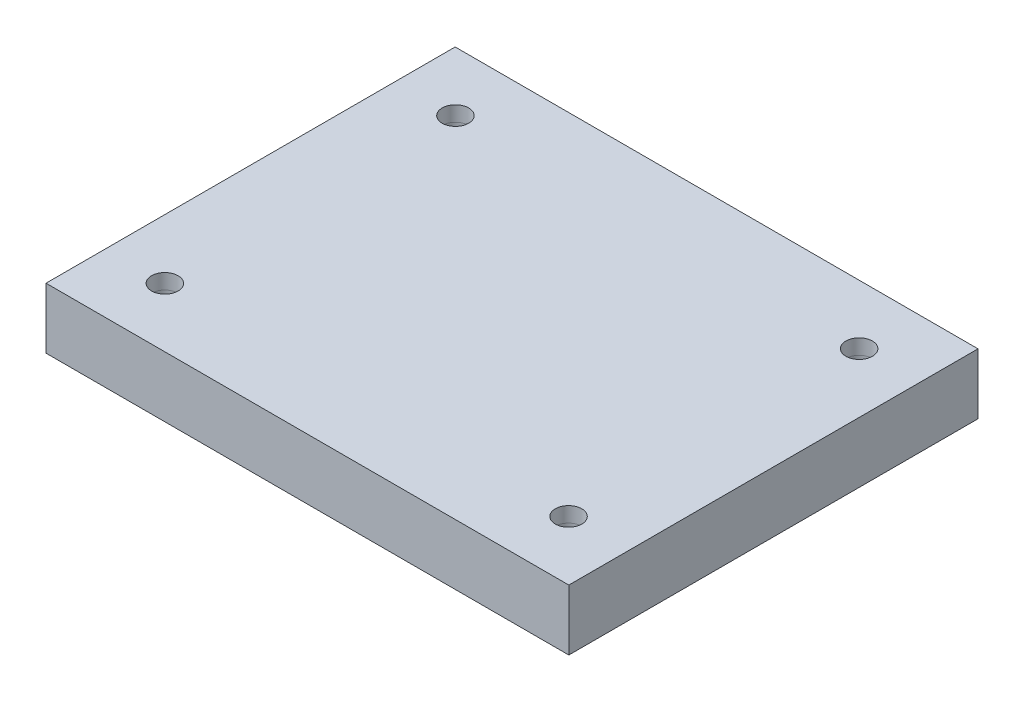
ISO-10303-21;
HEADER;
FILE_DESCRIPTION(('STEP AP214'),'2;1');
FILE_NAME('part.step','',(''),(''),'','','');
FILE_SCHEMA(('AUTOMOTIVE_DESIGN { 1 0 10303 214 1 1 1 1 }'));
ENDSEC;
DATA;
#1=APPLICATION_CONTEXT('core data for automotive mechanical design processes');
#2=APPLICATION_PROTOCOL_DEFINITION('international standard','automotive_design',2000,#1);
#3=PRODUCT_CONTEXT('',#1,'mechanical');
#4=PRODUCT('Part','Part','',(#3));
#5=PRODUCT_RELATED_PRODUCT_CATEGORY('part','',(#4));
#6=PRODUCT_DEFINITION_FORMATION('','',#4);
#7=PRODUCT_DEFINITION_CONTEXT('part definition',#1,'design');
#8=PRODUCT_DEFINITION('design','',#6,#7);
#9=PRODUCT_DEFINITION_SHAPE('','',#8);
#10=(LENGTH_UNIT() NAMED_UNIT(*) SI_UNIT(.MILLI.,.METRE.));
#11=(NAMED_UNIT(*) PLANE_ANGLE_UNIT() SI_UNIT($,.RADIAN.));
#12=(NAMED_UNIT(*) SI_UNIT($,.STERADIAN.) SOLID_ANGLE_UNIT());
#13=UNCERTAINTY_MEASURE_WITH_UNIT(LENGTH_MEASURE(1.E-05),#10,'distance_accuracy_value','');
#14=(GEOMETRIC_REPRESENTATION_CONTEXT(3) GLOBAL_UNCERTAINTY_ASSIGNED_CONTEXT((#13)) GLOBAL_UNIT_ASSIGNED_CONTEXT((#10,
#11,#12)) REPRESENTATION_CONTEXT('',''));
#15=CARTESIAN_POINT('',(0.,0.,0.));
#16=DIRECTION('',(0.,0.,1.));
#17=DIRECTION('',(1.,0.,0.));
#18=AXIS2_PLACEMENT_3D('',#15,#16,#17);
#19=CARTESIAN_POINT('',(26.638347595,0.,19.175016295));
#20=DIRECTION('',(0.,-1.,0.));
#21=DIRECTION('',(0.,0.,-1.));
#22=AXIS2_PLACEMENT_3D('',#19,#20,#21);
#23=PLANE('',#22);
#24=CARTESIAN_POINT('',(26.638347595,0.,19.175016295));
#25=DIRECTION('',(0.,-1.,0.));
#26=DIRECTION('',(0.,0.,-1.));
#27=AXIS2_PLACEMENT_3D('',#24,#25,#26);
#28=CIRCLE('',#27,3.9);
#29=CARTESIAN_POINT('',(26.638347595,0.,15.275016295));
#30=VERTEX_POINT('',#29);
#31=EDGE_CURVE('E68',#30,#30,#28,.T.);
#32=ORIENTED_EDGE('',*,*,#31,.T.);
#33=EDGE_LOOP('',(#32));
#34=FACE_BOUND('',#33,.T.);
#35=CARTESIAN_POINT('',(26.638347595,0.,19.175016295));
#36=DIRECTION('',(0.,-1.,0.));
#37=DIRECTION('',(0.,0.,-1.));
#38=AXIS2_PLACEMENT_3D('',#35,#36,#37);
#39=CIRCLE('',#38,1.75);
#40=CARTESIAN_POINT('',(26.638347595,0.,17.425016295));
#41=VERTEX_POINT('',#40);
#42=EDGE_CURVE('E56',#41,#41,#39,.T.);
#43=ORIENTED_EDGE('',*,*,#42,.F.);
#44=EDGE_LOOP('',(#43));
#45=FACE_BOUND('',#44,.T.);
#46=ADVANCED_FACE('F52',(#34,#45),#23,.T.);
#47=CARTESIAN_POINT('',(26.638347595,6.,19.175016295));
#48=DIRECTION('',(0.,-1.,0.));
#49=DIRECTION('',(0.,0.,-1.));
#50=AXIS2_PLACEMENT_3D('',#47,#48,#49);
#51=PLANE('',#50);
#52=CARTESIAN_POINT('',(26.638347595,6.,19.175016295));
#53=DIRECTION('',(0.,-1.,0.));
#54=DIRECTION('',(0.,0.,-1.));
#55=AXIS2_PLACEMENT_3D('',#52,#53,#54);
#56=CIRCLE('',#55,3.9);
#57=CARTESIAN_POINT('',(26.638347595,6.,15.275016295));
#58=VERTEX_POINT('',#57);
#59=EDGE_CURVE('E66',#58,#58,#56,.T.);
#60=ORIENTED_EDGE('',*,*,#59,.F.);
#61=EDGE_LOOP('',(#60));
#62=FACE_BOUND('',#61,.T.);
#63=CARTESIAN_POINT('',(26.638347595,6.,19.175016295));
#64=DIRECTION('',(0.,-1.,0.));
#65=DIRECTION('',(0.,0.,-1.));
#66=AXIS2_PLACEMENT_3D('',#63,#64,#65);
#67=CIRCLE('',#66,1.75);
#68=CARTESIAN_POINT('',(26.638347595,6.,17.425016295));
#69=VERTEX_POINT('',#68);
#70=EDGE_CURVE('E11',#69,#69,#67,.T.);
#71=ORIENTED_EDGE('',*,*,#70,.T.);
#72=EDGE_LOOP('',(#71));
#73=FACE_BOUND('',#72,.T.);
#74=ADVANCED_FACE('F77',(#62,#73),#51,.F.);
#75=CARTESIAN_POINT('',(26.638347595,0.,19.175016295));
#76=DIRECTION('',(0.,1.,0.));
#77=DIRECTION('',(0.,0.,1.));
#78=AXIS2_PLACEMENT_3D('',#75,#76,#77);
#79=CYLINDRICAL_SURFACE('',#78,3.9);
#80=ORIENTED_EDGE('',*,*,#31,.F.);
#81=EDGE_LOOP('',(#80));
#82=FACE_BOUND('',#81,.T.);
#83=ORIENTED_EDGE('',*,*,#59,.T.);
#84=EDGE_LOOP('',(#83));
#85=FACE_BOUND('',#84,.T.);
#86=ADVANCED_FACE('F75',(#82,#85),#79,.T.);
#87=CARTESIAN_POINT('',(26.638347595,0.,19.175016295));
#88=DIRECTION('',(0.,1.,0.));
#89=DIRECTION('',(0.,0.,1.));
#90=AXIS2_PLACEMENT_3D('',#87,#88,#89);
#91=CYLINDRICAL_SURFACE('',#90,1.75);
#92=ORIENTED_EDGE('',*,*,#42,.T.);
#93=EDGE_LOOP('',(#92));
#94=FACE_BOUND('',#93,.T.);
#95=ORIENTED_EDGE('',*,*,#70,.F.);
#96=EDGE_LOOP('',(#95));
#97=FACE_BOUND('',#96,.T.);
#98=ADVANCED_FACE('F54',(#94,#97),#91,.F.);
#99=CLOSED_SHELL('',(#46,#74,#86,#98));
#100=MANIFOLD_SOLID_BREP('B2',#99);
#101=CARTESIAN_POINT('',(26.638347595,0.,-19.175016295));
#102=DIRECTION('',(0.,-1.,0.));
#103=DIRECTION('',(0.,0.,-1.));
#104=AXIS2_PLACEMENT_3D('',#101,#102,#103);
#105=PLANE('',#104);
#106=CARTESIAN_POINT('',(26.638347595,0.,-19.175016295));
#107=DIRECTION('',(0.,-1.,0.));
#108=DIRECTION('',(0.,0.,-1.));
#109=AXIS2_PLACEMENT_3D('',#106,#107,#108);
#110=CIRCLE('',#109,3.9);
#111=CARTESIAN_POINT('',(26.638347595,0.,-23.075016295));
#112=VERTEX_POINT('',#111);
#113=EDGE_CURVE('E146',#112,#112,#110,.T.);
#114=ORIENTED_EDGE('',*,*,#113,.T.);
#115=EDGE_LOOP('',(#114));
#116=FACE_BOUND('',#115,.T.);
#117=CARTESIAN_POINT('',(26.638347595,0.,-19.175016295));
#118=DIRECTION('',(0.,-1.,0.));
#119=DIRECTION('',(0.,0.,-1.));
#120=AXIS2_PLACEMENT_3D('',#117,#118,#119);
#121=CIRCLE('',#120,1.75);
#122=CARTESIAN_POINT('',(26.638347595,0.,-20.925016295));
#123=VERTEX_POINT('',#122);
#124=EDGE_CURVE('E134',#123,#123,#121,.T.);
#125=ORIENTED_EDGE('',*,*,#124,.F.);
#126=EDGE_LOOP('',(#125));
#127=FACE_BOUND('',#126,.T.);
#128=ADVANCED_FACE('F130',(#116,#127),#105,.T.);
#129=CARTESIAN_POINT('',(26.638347595,6.,-19.175016295));
#130=DIRECTION('',(0.,-1.,0.));
#131=DIRECTION('',(0.,0.,-1.));
#132=AXIS2_PLACEMENT_3D('',#129,#130,#131);
#133=PLANE('',#132);
#134=CARTESIAN_POINT('',(26.638347595,6.,-19.175016295));
#135=DIRECTION('',(0.,-1.,0.));
#136=DIRECTION('',(0.,0.,-1.));
#137=AXIS2_PLACEMENT_3D('',#134,#135,#136);
#138=CIRCLE('',#137,3.9);
#139=CARTESIAN_POINT('',(26.638347595,6.,-23.075016295));
#140=VERTEX_POINT('',#139);
#141=EDGE_CURVE('E144',#140,#140,#138,.T.);
#142=ORIENTED_EDGE('',*,*,#141,.F.);
#143=EDGE_LOOP('',(#142));
#144=FACE_BOUND('',#143,.T.);
#145=CARTESIAN_POINT('',(26.638347595,6.,-19.175016295));
#146=DIRECTION('',(0.,-1.,0.));
#147=DIRECTION('',(0.,0.,-1.));
#148=AXIS2_PLACEMENT_3D('',#145,#146,#147);
#149=CIRCLE('',#148,1.75);
#150=CARTESIAN_POINT('',(26.638347595,6.,-20.925016295));
#151=VERTEX_POINT('',#150);
#152=EDGE_CURVE('E51',#151,#151,#149,.T.);
#153=ORIENTED_EDGE('',*,*,#152,.T.);
#154=EDGE_LOOP('',(#153));
#155=FACE_BOUND('',#154,.T.);
#156=ADVANCED_FACE('F155',(#144,#155),#133,.F.);
#157=CARTESIAN_POINT('',(26.638347595,0.,-19.175016295));
#158=DIRECTION('',(0.,1.,0.));
#159=DIRECTION('',(0.,0.,1.));
#160=AXIS2_PLACEMENT_3D('',#157,#158,#159);
#161=CYLINDRICAL_SURFACE('',#160,3.9);
#162=ORIENTED_EDGE('',*,*,#113,.F.);
#163=EDGE_LOOP('',(#162));
#164=FACE_BOUND('',#163,.T.);
#165=ORIENTED_EDGE('',*,*,#141,.T.);
#166=EDGE_LOOP('',(#165));
#167=FACE_BOUND('',#166,.T.);
#168=ADVANCED_FACE('F153',(#164,#167),#161,.T.);
#169=CARTESIAN_POINT('',(26.638347595,0.,-19.175016295));
#170=DIRECTION('',(0.,1.,0.));
#171=DIRECTION('',(0.,0.,1.));
#172=AXIS2_PLACEMENT_3D('',#169,#170,#171);
#173=CYLINDRICAL_SURFACE('',#172,1.75);
#174=ORIENTED_EDGE('',*,*,#124,.T.);
#175=EDGE_LOOP('',(#174));
#176=FACE_BOUND('',#175,.T.);
#177=ORIENTED_EDGE('',*,*,#152,.F.);
#178=EDGE_LOOP('',(#177));
#179=FACE_BOUND('',#178,.T.);
#180=ADVANCED_FACE('F132',(#176,#179),#173,.F.);
#181=CLOSED_SHELL('',(#128,#156,#168,#180));
#182=MANIFOLD_SOLID_BREP('B6',#181);
#183=CARTESIAN_POINT('',(-26.638347595,0.,-19.175016295));
#184=DIRECTION('',(0.,-1.,0.));
#185=DIRECTION('',(0.,0.,-1.));
#186=AXIS2_PLACEMENT_3D('',#183,#184,#185);
#187=PLANE('',#186);
#188=CARTESIAN_POINT('',(-26.638347595,0.,-19.175016295));
#189=DIRECTION('',(0.,-1.,0.));
#190=DIRECTION('',(0.,0.,-1.));
#191=AXIS2_PLACEMENT_3D('',#188,#189,#190);
#192=CIRCLE('',#191,3.9);
#193=CARTESIAN_POINT('',(-26.638347595,0.,-23.075016295));
#194=VERTEX_POINT('',#193);
#195=EDGE_CURVE('E223',#194,#194,#192,.T.);
#196=ORIENTED_EDGE('',*,*,#195,.T.);
#197=EDGE_LOOP('',(#196));
#198=FACE_BOUND('',#197,.T.);
#199=CARTESIAN_POINT('',(-26.638347595,0.,-19.175016295));
#200=DIRECTION('',(0.,-1.,0.));
#201=DIRECTION('',(0.,0.,-1.));
#202=AXIS2_PLACEMENT_3D('',#199,#200,#201);
#203=CIRCLE('',#202,1.75);
#204=CARTESIAN_POINT('',(-26.638347595,0.,-20.925016295));
#205=VERTEX_POINT('',#204);
#206=EDGE_CURVE('E212',#205,#205,#203,.T.);
#207=ORIENTED_EDGE('',*,*,#206,.F.);
#208=EDGE_LOOP('',(#207));
#209=FACE_BOUND('',#208,.T.);
#210=ADVANCED_FACE('F208',(#198,#209),#187,.T.);
#211=CARTESIAN_POINT('',(-26.638347595,6.,-19.175016295));
#212=DIRECTION('',(0.,-1.,0.));
#213=DIRECTION('',(0.,0.,-1.));
#214=AXIS2_PLACEMENT_3D('',#211,#212,#213);
#215=PLANE('',#214);
#216=CARTESIAN_POINT('',(-26.638347595,6.,-19.175016295));
#217=DIRECTION('',(0.,-1.,0.));
#218=DIRECTION('',(0.,0.,-1.));
#219=AXIS2_PLACEMENT_3D('',#216,#217,#218);
#220=CIRCLE('',#219,3.9);
#221=CARTESIAN_POINT('',(-26.638347595,6.,-23.075016295));
#222=VERTEX_POINT('',#221);
#223=EDGE_CURVE('E221',#222,#222,#220,.T.);
#224=ORIENTED_EDGE('',*,*,#223,.F.);
#225=EDGE_LOOP('',(#224));
#226=FACE_BOUND('',#225,.T.);
#227=CARTESIAN_POINT('',(-26.638347595,6.,-19.175016295));
#228=DIRECTION('',(0.,-1.,0.));
#229=DIRECTION('',(0.,0.,-1.));
#230=AXIS2_PLACEMENT_3D('',#227,#228,#229);
#231=CIRCLE('',#230,1.75);
#232=CARTESIAN_POINT('',(-26.638347595,6.,-20.925016295));
#233=VERTEX_POINT('',#232);
#234=EDGE_CURVE('E129',#233,#233,#231,.T.);
#235=ORIENTED_EDGE('',*,*,#234,.T.);
#236=EDGE_LOOP('',(#235));
#237=FACE_BOUND('',#236,.T.);
#238=ADVANCED_FACE('F233',(#226,#237),#215,.F.);
#239=CARTESIAN_POINT('',(-26.638347595,0.,-19.175016295));
#240=DIRECTION('',(0.,1.,0.));
#241=DIRECTION('',(0.,0.,1.));
#242=AXIS2_PLACEMENT_3D('',#239,#240,#241);
#243=CYLINDRICAL_SURFACE('',#242,3.9);
#244=ORIENTED_EDGE('',*,*,#195,.F.);
#245=EDGE_LOOP('',(#244));
#246=FACE_BOUND('',#245,.T.);
#247=ORIENTED_EDGE('',*,*,#223,.T.);
#248=EDGE_LOOP('',(#247));
#249=FACE_BOUND('',#248,.T.);
#250=ADVANCED_FACE('F231',(#246,#249),#243,.T.);
#251=CARTESIAN_POINT('',(-26.638347595,0.,-19.175016295));
#252=DIRECTION('',(0.,1.,0.));
#253=DIRECTION('',(0.,0.,1.));
#254=AXIS2_PLACEMENT_3D('',#251,#252,#253);
#255=CYLINDRICAL_SURFACE('',#254,1.75);
#256=ORIENTED_EDGE('',*,*,#206,.T.);
#257=EDGE_LOOP('',(#256));
#258=FACE_BOUND('',#257,.T.);
#259=ORIENTED_EDGE('',*,*,#234,.F.);
#260=EDGE_LOOP('',(#259));
#261=FACE_BOUND('',#260,.T.);
#262=ADVANCED_FACE('F210',(#258,#261),#255,.F.);
#263=CLOSED_SHELL('',(#210,#238,#250,#262));
#264=MANIFOLD_SOLID_BREP('B46',#263);
#265=CARTESIAN_POINT('',(-26.638347595,0.,19.175016295));
#266=DIRECTION('',(0.,-1.,0.));
#267=DIRECTION('',(0.,0.,-1.));
#268=AXIS2_PLACEMENT_3D('',#265,#266,#267);
#269=PLANE('',#268);
#270=CARTESIAN_POINT('',(-26.638347595,0.,19.175016295));
#271=DIRECTION('',(0.,-1.,0.));
#272=DIRECTION('',(0.,0.,-1.));
#273=AXIS2_PLACEMENT_3D('',#270,#271,#272);
#274=CIRCLE('',#273,3.9);
#275=CARTESIAN_POINT('',(-26.638347595,0.,15.275016295));
#276=VERTEX_POINT('',#275);
#277=EDGE_CURVE('E207',#276,#276,#274,.T.);
#278=ORIENTED_EDGE('',*,*,#277,.T.);
#279=EDGE_LOOP('',(#278));
#280=FACE_BOUND('',#279,.T.);
#281=CARTESIAN_POINT('',(-26.638347595,0.,19.175016295));
#282=DIRECTION('',(0.,-1.,0.));
#283=DIRECTION('',(0.,0.,-1.));
#284=AXIS2_PLACEMENT_3D('',#281,#282,#283);
#285=CIRCLE('',#284,1.75);
#286=CARTESIAN_POINT('',(-26.638347595,0.,17.425016295));
#287=VERTEX_POINT('',#286);
#288=EDGE_CURVE('E301',#287,#287,#285,.T.);
#289=ORIENTED_EDGE('',*,*,#288,.F.);
#290=EDGE_LOOP('',(#289));
#291=FACE_BOUND('',#290,.T.);
#292=ADVANCED_FACE('F287',(#280,#291),#269,.T.);
#293=CARTESIAN_POINT('',(-26.638347595,6.,19.175016295));
#294=DIRECTION('',(0.,-1.,0.));
#295=DIRECTION('',(0.,0.,-1.));
#296=AXIS2_PLACEMENT_3D('',#293,#294,#295);
#297=PLANE('',#296);
#298=CARTESIAN_POINT('',(-26.638347595,6.,19.175016295));
#299=DIRECTION('',(0.,-1.,0.));
#300=DIRECTION('',(0.,0.,-1.));
#301=AXIS2_PLACEMENT_3D('',#298,#299,#300);
#302=CIRCLE('',#301,3.9);
#303=CARTESIAN_POINT('',(-26.638347595,6.,15.275016295));
#304=VERTEX_POINT('',#303);
#305=EDGE_CURVE('E291',#304,#304,#302,.T.);
#306=ORIENTED_EDGE('',*,*,#305,.F.);
#307=EDGE_LOOP('',(#306));
#308=FACE_BOUND('',#307,.T.);
#309=CARTESIAN_POINT('',(-26.638347595,6.,19.175016295));
#310=DIRECTION('',(0.,-1.,0.));
#311=DIRECTION('',(0.,0.,-1.));
#312=AXIS2_PLACEMENT_3D('',#309,#310,#311);
#313=CIRCLE('',#312,1.75);
#314=CARTESIAN_POINT('',(-26.638347595,6.,17.425016295));
#315=VERTEX_POINT('',#314);
#316=EDGE_CURVE('E303',#315,#315,#313,.T.);
#317=ORIENTED_EDGE('',*,*,#316,.T.);
#318=EDGE_LOOP('',(#317));
#319=FACE_BOUND('',#318,.T.);
#320=ADVANCED_FACE('F314',(#308,#319),#297,.F.);
#321=CARTESIAN_POINT('',(-26.638347595,0.,19.175016295));
#322=DIRECTION('',(0.,1.,0.));
#323=DIRECTION('',(0.,0.,1.));
#324=AXIS2_PLACEMENT_3D('',#321,#322,#323);
#325=CYLINDRICAL_SURFACE('',#324,3.9);
#326=ORIENTED_EDGE('',*,*,#277,.F.);
#327=EDGE_LOOP('',(#326));
#328=FACE_BOUND('',#327,.T.);
#329=ORIENTED_EDGE('',*,*,#305,.T.);
#330=EDGE_LOOP('',(#329));
#331=FACE_BOUND('',#330,.T.);
#332=ADVANCED_FACE('F289',(#328,#331),#325,.T.);
#333=CARTESIAN_POINT('',(-26.638347595,0.,19.175016295));
#334=DIRECTION('',(0.,1.,0.));
#335=DIRECTION('',(0.,0.,1.));
#336=AXIS2_PLACEMENT_3D('',#333,#334,#335);
#337=CYLINDRICAL_SURFACE('',#336,1.75);
#338=ORIENTED_EDGE('',*,*,#288,.T.);
#339=EDGE_LOOP('',(#338));
#340=FACE_BOUND('',#339,.T.);
#341=ORIENTED_EDGE('',*,*,#316,.F.);
#342=EDGE_LOOP('',(#341));
#343=FACE_BOUND('',#342,.T.);
#344=ADVANCED_FACE('F310',(#340,#343),#337,.F.);
#345=CLOSED_SHELL('',(#292,#320,#332,#344));
#346=MANIFOLD_SOLID_BREP('B124',#345);
#347=CARTESIAN_POINT('',(0.,0.,0.));
#348=DIRECTION('',(0.,1.,0.));
#349=DIRECTION('',(0.,0.,1.));
#350=AXIS2_PLACEMENT_3D('',#347,#348,#349);
#351=PLANE('',#350);
#352=DIRECTION('',(1.,0.,0.));
#353=VECTOR('',#352,1.);
#354=CARTESIAN_POINT('',(-34.5,0.,27.));
#355=LINE('',#354,#353);
#356=CARTESIAN_POINT('',(-34.5,0.,27.));
#357=VERTEX_POINT('',#356);
#358=CARTESIAN_POINT('',(34.5,0.,27.));
#359=VERTEX_POINT('',#358);
#360=EDGE_CURVE('E505',#357,#359,#355,.T.);
#361=ORIENTED_EDGE('',*,*,#360,.F.);
#362=DIRECTION('',(0.,0.,1.));
#363=VECTOR('',#362,1.);
#364=CARTESIAN_POINT('',(-34.5,0.,27.));
#365=LINE('',#364,#363);
#366=CARTESIAN_POINT('',(-34.5,0.,-27.));
#367=VERTEX_POINT('',#366);
#368=EDGE_CURVE('E432',#367,#357,#365,.T.);
#369=ORIENTED_EDGE('',*,*,#368,.F.);
#370=DIRECTION('',(-1.,0.,0.));
#371=VECTOR('',#370,1.);
#372=CARTESIAN_POINT('',(-34.5,0.,-27.));
#373=LINE('',#372,#371);
#374=CARTESIAN_POINT('',(34.5,0.,-27.));
#375=VERTEX_POINT('',#374);
#376=EDGE_CURVE('E511',#375,#367,#373,.T.);
#377=ORIENTED_EDGE('',*,*,#376,.F.);
#378=DIRECTION('',(0.,0.,-1.));
#379=VECTOR('',#378,1.);
#380=CARTESIAN_POINT('',(34.5,0.,27.));
#381=LINE('',#380,#379);
#382=EDGE_CURVE('E508',#359,#375,#381,.T.);
#383=ORIENTED_EDGE('',*,*,#382,.F.);
#384=EDGE_LOOP('',(#361,#369,#377,#383));
#385=FACE_BOUND('',#384,.T.);
#386=DIRECTION('',(0.,0.,-1.));
#387=VECTOR('',#386,1.);
#388=CARTESIAN_POINT('',(30.5,0.,23.));
#389=LINE('',#388,#387);
#390=CARTESIAN_POINT('',(30.5,0.,23.));
#391=VERTEX_POINT('',#390);
#392=CARTESIAN_POINT('',(30.5,0.,-23.));
#393=VERTEX_POINT('',#392);
#394=EDGE_CURVE('E381',#391,#393,#389,.T.);
#395=ORIENTED_EDGE('',*,*,#394,.T.);
#396=DIRECTION('',(-1.,0.,0.));
#397=VECTOR('',#396,1.);
#398=CARTESIAN_POINT('',(-30.5,0.,-23.));
#399=LINE('',#398,#397);
#400=CARTESIAN_POINT('',(-30.5,0.,-23.));
#401=VERTEX_POINT('',#400);
#402=EDGE_CURVE('E483',#393,#401,#399,.T.);
#403=ORIENTED_EDGE('',*,*,#402,.T.);
#404=DIRECTION('',(0.,0.,1.));
#405=VECTOR('',#404,1.);
#406=CARTESIAN_POINT('',(-30.5,0.,23.));
#407=LINE('',#406,#405);
#408=CARTESIAN_POINT('',(-30.5,0.,23.));
#409=VERTEX_POINT('',#408);
#410=EDGE_CURVE('E487',#401,#409,#407,.T.);
#411=ORIENTED_EDGE('',*,*,#410,.T.);
#412=DIRECTION('',(1.,0.,0.));
#413=VECTOR('',#412,1.);
#414=CARTESIAN_POINT('',(-30.5,0.,23.));
#415=LINE('',#414,#413);
#416=EDGE_CURVE('E471',#409,#391,#415,.T.);
#417=ORIENTED_EDGE('',*,*,#416,.T.);
#418=EDGE_LOOP('',(#395,#403,#411,#417));
#419=FACE_BOUND('',#418,.T.);
#420=ADVANCED_FACE('F357',(#385,#419),#351,.F.);
#421=CARTESIAN_POINT('',(-34.5,6.,27.));
#422=DIRECTION('',(0.,0.,-1.));
#423=DIRECTION('',(-1.,0.,0.));
#424=AXIS2_PLACEMENT_3D('',#421,#422,#423);
#425=PLANE('',#424);
#426=ORIENTED_EDGE('',*,*,#360,.T.);
#427=DIRECTION('',(0.,-1.,0.));
#428=VECTOR('',#427,1.);
#429=CARTESIAN_POINT('',(34.5,6.,27.));
#430=LINE('',#429,#428);
#431=CARTESIAN_POINT('',(34.5,8.,27.));
#432=VERTEX_POINT('',#431);
#433=EDGE_CURVE('E285',#432,#359,#430,.T.);
#434=ORIENTED_EDGE('',*,*,#433,.F.);
#435=DIRECTION('',(1.,0.,0.));
#436=VECTOR('',#435,1.);
#437=CARTESIAN_POINT('',(-34.5,8.,27.));
#438=LINE('',#437,#436);
#439=CARTESIAN_POINT('',(-34.5,8.,27.));
#440=VERTEX_POINT('',#439);
#441=EDGE_CURVE('E440',#440,#432,#438,.T.);
#442=ORIENTED_EDGE('',*,*,#441,.F.);
#443=DIRECTION('',(0.,-1.,0.));
#444=VECTOR('',#443,1.);
#445=CARTESIAN_POINT('',(-34.5,6.,27.));
#446=LINE('',#445,#444);
#447=EDGE_CURVE('E425',#440,#357,#446,.T.);
#448=ORIENTED_EDGE('',*,*,#447,.T.);
#449=EDGE_LOOP('',(#426,#434,#442,#448));
#450=FACE_BOUND('',#449,.T.);
#451=ADVANCED_FACE('F359',(#450),#425,.F.);
#452=CARTESIAN_POINT('',(34.5,6.,27.));
#453=DIRECTION('',(-1.,0.,0.));
#454=DIRECTION('',(0.,0.,1.));
#455=AXIS2_PLACEMENT_3D('',#452,#453,#454);
#456=PLANE('',#455);
#457=ORIENTED_EDGE('',*,*,#382,.T.);
#458=DIRECTION('',(0.,-1.,0.));
#459=VECTOR('',#458,1.);
#460=CARTESIAN_POINT('',(34.5,6.,-27.));
#461=LINE('',#460,#459);
#462=CARTESIAN_POINT('',(34.5,8.,-27.));
#463=VERTEX_POINT('',#462);
#464=EDGE_CURVE('E366',#463,#375,#461,.T.);
#465=ORIENTED_EDGE('',*,*,#464,.F.);
#466=DIRECTION('',(0.,0.,-1.));
#467=VECTOR('',#466,1.);
#468=CARTESIAN_POINT('',(34.5,8.,27.));
#469=LINE('',#468,#467);
#470=EDGE_CURVE('E445',#432,#463,#469,.T.);
#471=ORIENTED_EDGE('',*,*,#470,.F.);
#472=ORIENTED_EDGE('',*,*,#433,.T.);
#473=EDGE_LOOP('',(#457,#465,#471,#472));
#474=FACE_BOUND('',#473,.T.);
#475=ADVANCED_FACE('F525',(#474),#456,.F.);
#476=CARTESIAN_POINT('',(-34.5,6.,-27.));
#477=DIRECTION('',(0.,0.,1.));
#478=DIRECTION('',(1.,0.,0.));
#479=AXIS2_PLACEMENT_3D('',#476,#477,#478);
#480=PLANE('',#479);
#481=ORIENTED_EDGE('',*,*,#376,.T.);
#482=DIRECTION('',(0.,-1.,0.));
#483=VECTOR('',#482,1.);
#484=CARTESIAN_POINT('',(-34.5,6.,-27.));
#485=LINE('',#484,#483);
#486=CARTESIAN_POINT('',(-34.5,8.,-27.));
#487=VERTEX_POINT('',#486);
#488=EDGE_CURVE('E437',#487,#367,#485,.T.);
#489=ORIENTED_EDGE('',*,*,#488,.F.);
#490=DIRECTION('',(-1.,0.,0.));
#491=VECTOR('',#490,1.);
#492=CARTESIAN_POINT('',(-34.5,8.,-27.));
#493=LINE('',#492,#491);
#494=EDGE_CURVE('E451',#463,#487,#493,.T.);
#495=ORIENTED_EDGE('',*,*,#494,.F.);
#496=ORIENTED_EDGE('',*,*,#464,.T.);
#497=EDGE_LOOP('',(#481,#489,#495,#496));
#498=FACE_BOUND('',#497,.T.);
#499=ADVANCED_FACE('F521',(#498),#480,.F.);
#500=CARTESIAN_POINT('',(-34.5,6.,27.));
#501=DIRECTION('',(1.,0.,0.));
#502=DIRECTION('',(0.,0.,-1.));
#503=AXIS2_PLACEMENT_3D('',#500,#501,#502);
#504=PLANE('',#503);
#505=ORIENTED_EDGE('',*,*,#368,.T.);
#506=ORIENTED_EDGE('',*,*,#447,.F.);
#507=DIRECTION('',(0.,0.,1.));
#508=VECTOR('',#507,1.);
#509=CARTESIAN_POINT('',(-34.5,8.,27.));
#510=LINE('',#509,#508);
#511=EDGE_CURVE('E430',#487,#440,#510,.T.);
#512=ORIENTED_EDGE('',*,*,#511,.F.);
#513=ORIENTED_EDGE('',*,*,#488,.T.);
#514=EDGE_LOOP('',(#505,#506,#512,#513));
#515=FACE_BOUND('',#514,.T.);
#516=ADVANCED_FACE('F427',(#515),#504,.F.);
#517=CARTESIAN_POINT('',(30.5,6.,23.));
#518=DIRECTION('',(-1.,0.,0.));
#519=DIRECTION('',(0.,0.,1.));
#520=AXIS2_PLACEMENT_3D('',#517,#518,#519);
#521=PLANE('',#520);
#522=ORIENTED_EDGE('',*,*,#394,.F.);
#523=DIRECTION('',(0.,-1.,0.));
#524=VECTOR('',#523,1.);
#525=CARTESIAN_POINT('',(30.5,6.,23.));
#526=LINE('',#525,#524);
#527=CARTESIAN_POINT('',(30.5,6.,23.));
#528=VERTEX_POINT('',#527);
#529=EDGE_CURVE('E480',#528,#391,#526,.T.);
#530=ORIENTED_EDGE('',*,*,#529,.F.);
#531=DIRECTION('',(0.,0.,-1.));
#532=VECTOR('',#531,1.);
#533=CARTESIAN_POINT('',(30.5,6.,23.));
#534=LINE('',#533,#532);
#535=CARTESIAN_POINT('',(30.5,6.,-23.));
#536=VERTEX_POINT('',#535);
#537=EDGE_CURVE('E466',#528,#536,#534,.T.);
#538=ORIENTED_EDGE('',*,*,#537,.T.);
#539=DIRECTION('',(0.,-1.,0.));
#540=VECTOR('',#539,1.);
#541=CARTESIAN_POINT('',(30.5,6.,-23.));
#542=LINE('',#541,#540);
#543=EDGE_CURVE('E502',#536,#393,#542,.T.);
#544=ORIENTED_EDGE('',*,*,#543,.T.);
#545=EDGE_LOOP('',(#522,#530,#538,#544));
#546=FACE_BOUND('',#545,.T.);
#547=ADVANCED_FACE('F536',(#546),#521,.T.);
#548=CARTESIAN_POINT('',(-30.5,6.,-23.));
#549=DIRECTION('',(0.,0.,1.));
#550=DIRECTION('',(1.,0.,0.));
#551=AXIS2_PLACEMENT_3D('',#548,#549,#550);
#552=PLANE('',#551);
#553=ORIENTED_EDGE('',*,*,#402,.F.);
#554=ORIENTED_EDGE('',*,*,#543,.F.);
#555=DIRECTION('',(-1.,0.,0.));
#556=VECTOR('',#555,1.);
#557=CARTESIAN_POINT('',(-30.5,6.,-23.));
#558=LINE('',#557,#556);
#559=CARTESIAN_POINT('',(-30.5,6.,-23.));
#560=VERTEX_POINT('',#559);
#561=EDGE_CURVE('E470',#536,#560,#558,.T.);
#562=ORIENTED_EDGE('',*,*,#561,.T.);
#563=DIRECTION('',(0.,-1.,0.));
#564=VECTOR('',#563,1.);
#565=CARTESIAN_POINT('',(-30.5,6.,-23.));
#566=LINE('',#565,#564);
#567=EDGE_CURVE('E499',#560,#401,#566,.T.);
#568=ORIENTED_EDGE('',*,*,#567,.T.);
#569=EDGE_LOOP('',(#553,#554,#562,#568));
#570=FACE_BOUND('',#569,.T.);
#571=ADVANCED_FACE('F541',(#570),#552,.T.);
#572=CARTESIAN_POINT('',(-30.5,6.,23.));
#573=DIRECTION('',(1.,0.,0.));
#574=DIRECTION('',(0.,0.,-1.));
#575=AXIS2_PLACEMENT_3D('',#572,#573,#574);
#576=PLANE('',#575);
#577=ORIENTED_EDGE('',*,*,#410,.F.);
#578=ORIENTED_EDGE('',*,*,#567,.F.);
#579=DIRECTION('',(0.,0.,1.));
#580=VECTOR('',#579,1.);
#581=CARTESIAN_POINT('',(-30.5,6.,23.));
#582=LINE('',#581,#580);
#583=CARTESIAN_POINT('',(-30.5,6.,23.));
#584=VERTEX_POINT('',#583);
#585=EDGE_CURVE('E474',#560,#584,#582,.T.);
#586=ORIENTED_EDGE('',*,*,#585,.T.);
#587=DIRECTION('',(0.,-1.,0.));
#588=VECTOR('',#587,1.);
#589=CARTESIAN_POINT('',(-30.5,6.,23.));
#590=LINE('',#589,#588);
#591=EDGE_CURVE('E496',#584,#409,#590,.T.);
#592=ORIENTED_EDGE('',*,*,#591,.T.);
#593=EDGE_LOOP('',(#577,#578,#586,#592));
#594=FACE_BOUND('',#593,.T.);
#595=ADVANCED_FACE('F544',(#594),#576,.T.);
#596=CARTESIAN_POINT('',(-30.5,6.,23.));
#597=DIRECTION('',(0.,0.,-1.));
#598=DIRECTION('',(-1.,0.,0.));
#599=AXIS2_PLACEMENT_3D('',#596,#597,#598);
#600=PLANE('',#599);
#601=ORIENTED_EDGE('',*,*,#416,.F.);
#602=ORIENTED_EDGE('',*,*,#591,.F.);
#603=DIRECTION('',(1.,0.,0.));
#604=VECTOR('',#603,1.);
#605=CARTESIAN_POINT('',(-30.5,6.,23.));
#606=LINE('',#605,#604);
#607=EDGE_CURVE('E373',#584,#528,#606,.T.);
#608=ORIENTED_EDGE('',*,*,#607,.T.);
#609=ORIENTED_EDGE('',*,*,#529,.T.);
#610=EDGE_LOOP('',(#601,#602,#608,#609));
#611=FACE_BOUND('',#610,.T.);
#612=ADVANCED_FACE('F548',(#611),#600,.T.);
#613=CARTESIAN_POINT('',(0.,6.,0.));
#614=DIRECTION('',(0.,-1.,0.));
#615=DIRECTION('',(0.,0.,-1.));
#616=AXIS2_PLACEMENT_3D('',#613,#614,#615);
#617=PLANE('',#616);
#618=CARTESIAN_POINT('',(-26.638347595,6.,19.175016295));
#619=DIRECTION('',(0.,1.,0.));
#620=DIRECTION('',(0.,0.,-1.));
#621=AXIS2_PLACEMENT_3D('',#618,#619,#620);
#622=CIRCLE('',#621,1.75);
#623=CARTESIAN_POINT('',(-26.638347595,6.,17.425016295));
#624=VERTEX_POINT('',#623);
#625=EDGE_CURVE('E583',#624,#624,#622,.T.);
#626=ORIENTED_EDGE('',*,*,#625,.T.);
#627=EDGE_LOOP('',(#626));
#628=FACE_BOUND('',#627,.T.);
#629=CARTESIAN_POINT('',(26.638347595,6.,-19.175016295));
#630=DIRECTION('',(0.,1.,0.));
#631=DIRECTION('',(0.,0.,-1.));
#632=AXIS2_PLACEMENT_3D('',#629,#630,#631);
#633=CIRCLE('',#632,1.75);
#634=CARTESIAN_POINT('',(26.638347595,6.,-20.925016295));
#635=VERTEX_POINT('',#634);
#636=EDGE_CURVE('E594',#635,#635,#633,.T.);
#637=ORIENTED_EDGE('',*,*,#636,.T.);
#638=EDGE_LOOP('',(#637));
#639=FACE_BOUND('',#638,.T.);
#640=CARTESIAN_POINT('',(-26.638347595,6.,-19.175016295));
#641=DIRECTION('',(0.,1.,0.));
#642=DIRECTION('',(0.,0.,1.));
#643=AXIS2_PLACEMENT_3D('',#640,#641,#642);
#644=CIRCLE('',#643,1.75);
#645=CARTESIAN_POINT('',(-26.638347595,6.,-17.425016295));
#646=VERTEX_POINT('',#645);
#647=EDGE_CURVE('E458',#646,#646,#644,.T.);
#648=ORIENTED_EDGE('',*,*,#647,.T.);
#649=EDGE_LOOP('',(#648));
#650=FACE_BOUND('',#649,.T.);
#651=CARTESIAN_POINT('',(26.638347595,6.,19.175016295));
#652=DIRECTION('',(0.,1.,0.));
#653=DIRECTION('',(0.,0.,1.));
#654=AXIS2_PLACEMENT_3D('',#651,#652,#653);
#655=CIRCLE('',#654,1.75);
#656=CARTESIAN_POINT('',(26.638347595,6.,20.925016295));
#657=VERTEX_POINT('',#656);
#658=EDGE_CURVE('E587',#657,#657,#655,.T.);
#659=ORIENTED_EDGE('',*,*,#658,.T.);
#660=EDGE_LOOP('',(#659));
#661=FACE_BOUND('',#660,.T.);
#662=ORIENTED_EDGE('',*,*,#561,.F.);
#663=ORIENTED_EDGE('',*,*,#537,.F.);
#664=ORIENTED_EDGE('',*,*,#607,.F.);
#665=ORIENTED_EDGE('',*,*,#585,.F.);
#666=EDGE_LOOP('',(#662,#663,#664,#665));
#667=FACE_BOUND('',#666,.T.);
#668=ADVANCED_FACE('F554',(#628,#639,#650,#661,#667),#617,.T.);
#669=CARTESIAN_POINT('',(0.,8.,0.));
#670=DIRECTION('',(0.,-1.,0.));
#671=DIRECTION('',(0.,0.,-1.));
#672=AXIS2_PLACEMENT_3D('',#669,#670,#671);
#673=PLANE('',#672);
#674=ORIENTED_EDGE('',*,*,#511,.T.);
#675=ORIENTED_EDGE('',*,*,#441,.T.);
#676=ORIENTED_EDGE('',*,*,#470,.T.);
#677=ORIENTED_EDGE('',*,*,#494,.T.);
#678=EDGE_LOOP('',(#674,#675,#676,#677));
#679=FACE_BOUND('',#678,.T.);
#680=CARTESIAN_POINT('',(-26.638347595,8.,-19.175016295));
#681=DIRECTION('',(0.,1.,0.));
#682=DIRECTION('',(0.,0.,1.));
#683=AXIS2_PLACEMENT_3D('',#680,#681,#682);
#684=CIRCLE('',#683,1.75);
#685=CARTESIAN_POINT('',(-26.638347595,8.,-17.425016295));
#686=VERTEX_POINT('',#685);
#687=EDGE_CURVE('E453',#686,#686,#684,.T.);
#688=ORIENTED_EDGE('',*,*,#687,.F.);
#689=EDGE_LOOP('',(#688));
#690=FACE_BOUND('',#689,.T.);
#691=CARTESIAN_POINT('',(26.638347595,8.,-19.175016295));
#692=DIRECTION('',(0.,1.,0.));
#693=DIRECTION('',(0.,0.,-1.));
#694=AXIS2_PLACEMENT_3D('',#691,#692,#693);
#695=CIRCLE('',#694,1.75);
#696=CARTESIAN_POINT('',(26.638347595,8.,-20.925016295));
#697=VERTEX_POINT('',#696);
#698=EDGE_CURVE('E598',#697,#697,#695,.T.);
#699=ORIENTED_EDGE('',*,*,#698,.F.);
#700=EDGE_LOOP('',(#699));
#701=FACE_BOUND('',#700,.T.);
#702=CARTESIAN_POINT('',(26.638347595,8.,19.175016295));
#703=DIRECTION('',(0.,1.,0.));
#704=DIRECTION('',(0.,0.,1.));
#705=AXIS2_PLACEMENT_3D('',#702,#703,#704);
#706=CIRCLE('',#705,1.75);
#707=CARTESIAN_POINT('',(26.638347595,8.,20.925016295));
#708=VERTEX_POINT('',#707);
#709=EDGE_CURVE('E590',#708,#708,#706,.T.);
#710=ORIENTED_EDGE('',*,*,#709,.F.);
#711=EDGE_LOOP('',(#710));
#712=FACE_BOUND('',#711,.T.);
#713=CARTESIAN_POINT('',(-26.638347595,8.,19.175016295));
#714=DIRECTION('',(0.,1.,0.));
#715=DIRECTION('',(0.,0.,-1.));
#716=AXIS2_PLACEMENT_3D('',#713,#714,#715);
#717=CIRCLE('',#716,1.75);
#718=CARTESIAN_POINT('',(-26.638347595,8.,17.425016295));
#719=VERTEX_POINT('',#718);
#720=EDGE_CURVE('E580',#719,#719,#717,.T.);
#721=ORIENTED_EDGE('',*,*,#720,.F.);
#722=EDGE_LOOP('',(#721));
#723=FACE_BOUND('',#722,.T.);
#724=ADVANCED_FACE('F448',(#679,#690,#701,#712,#723),#673,.F.);
#725=CARTESIAN_POINT('',(-26.638347595,8.,-19.175016295));
#726=DIRECTION('',(0.,-1.,0.));
#727=DIRECTION('',(0.,0.,-1.));
#728=AXIS2_PLACEMENT_3D('',#725,#726,#727);
#729=CYLINDRICAL_SURFACE('',#728,1.75);
#730=ORIENTED_EDGE('',*,*,#687,.T.);
#731=EDGE_LOOP('',(#730));
#732=FACE_BOUND('',#731,.T.);
#733=ORIENTED_EDGE('',*,*,#647,.F.);
#734=EDGE_LOOP('',(#733));
#735=FACE_BOUND('',#734,.T.);
#736=ADVANCED_FACE('F561',(#732,#735),#729,.F.);
#737=CARTESIAN_POINT('',(26.638347595,8.,-19.175016295));
#738=DIRECTION('',(0.,-1.,0.));
#739=DIRECTION('',(0.,0.,-1.));
#740=AXIS2_PLACEMENT_3D('',#737,#738,#739);
#741=CYLINDRICAL_SURFACE('',#740,1.75);
#742=ORIENTED_EDGE('',*,*,#698,.T.);
#743=EDGE_LOOP('',(#742));
#744=FACE_BOUND('',#743,.T.);
#745=ORIENTED_EDGE('',*,*,#636,.F.);
#746=EDGE_LOOP('',(#745));
#747=FACE_BOUND('',#746,.T.);
#748=ADVANCED_FACE('F564',(#744,#747),#741,.F.);
#749=CARTESIAN_POINT('',(26.638347595,8.,19.175016295));
#750=DIRECTION('',(0.,-1.,0.));
#751=DIRECTION('',(0.,0.,-1.));
#752=AXIS2_PLACEMENT_3D('',#749,#750,#751);
#753=CYLINDRICAL_SURFACE('',#752,1.75);
#754=ORIENTED_EDGE('',*,*,#709,.T.);
#755=EDGE_LOOP('',(#754));
#756=FACE_BOUND('',#755,.T.);
#757=ORIENTED_EDGE('',*,*,#658,.F.);
#758=EDGE_LOOP('',(#757));
#759=FACE_BOUND('',#758,.T.);
#760=ADVANCED_FACE('F568',(#756,#759),#753,.F.);
#761=CARTESIAN_POINT('',(-26.638347595,8.,19.175016295));
#762=DIRECTION('',(0.,-1.,0.));
#763=DIRECTION('',(0.,0.,-1.));
#764=AXIS2_PLACEMENT_3D('',#761,#762,#763);
#765=CYLINDRICAL_SURFACE('',#764,1.75);
#766=ORIENTED_EDGE('',*,*,#720,.T.);
#767=EDGE_LOOP('',(#766));
#768=FACE_BOUND('',#767,.T.);
#769=ORIENTED_EDGE('',*,*,#625,.F.);
#770=EDGE_LOOP('',(#769));
#771=FACE_BOUND('',#770,.T.);
#772=ADVANCED_FACE('F572',(#768,#771),#765,.F.);
#773=CLOSED_SHELL('',(#420,#451,#475,#499,#516,#547,#571,#595,#612,#668,#724,#736,#748,#760,#772));
#774=MANIFOLD_SOLID_BREP('B202',#773);
#775=ADVANCED_BREP_SHAPE_REPRESENTATION('',(#18,#100,#182,#264,#346,#774),#14);
#776=SHAPE_DEFINITION_REPRESENTATION(#9,#775);
ENDSEC;
END-ISO-10303-21;
